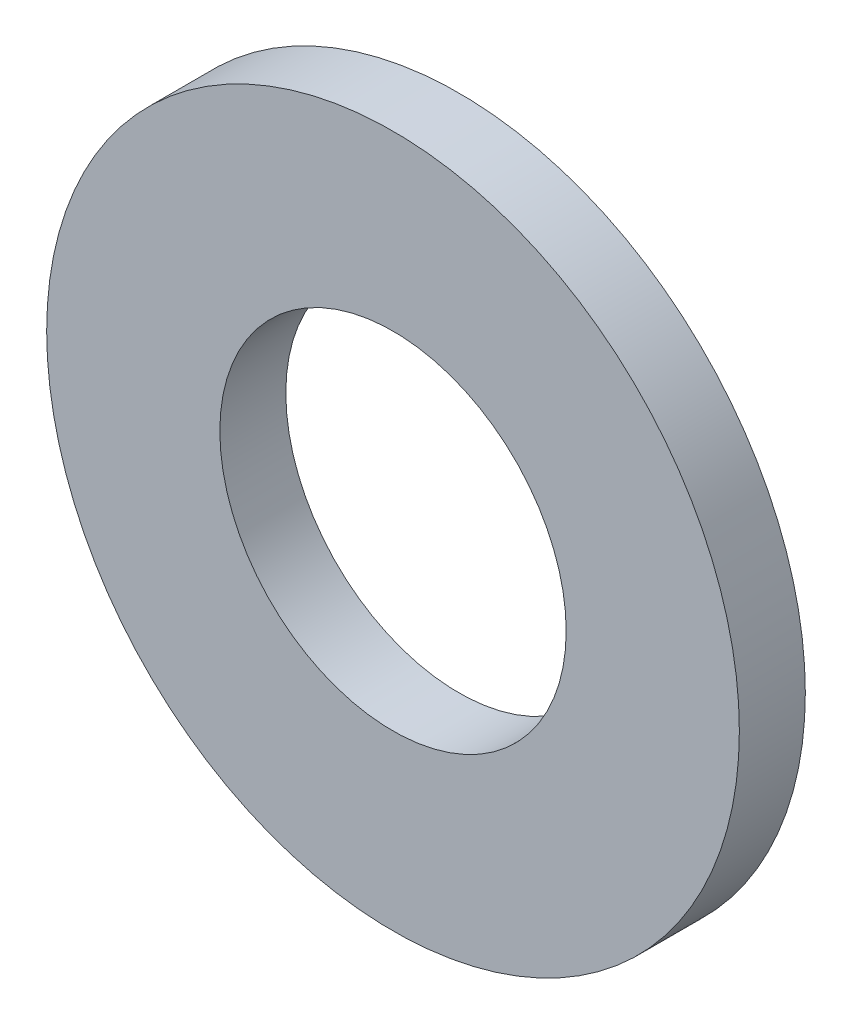
ISO-10303-21;
HEADER;
FILE_DESCRIPTION(('STEP AP214'),'2;1');
FILE_NAME('part.step','',(''),(''),'','','');
FILE_SCHEMA(('AUTOMOTIVE_DESIGN { 1 0 10303 214 1 1 1 1 }'));
ENDSEC;
DATA;
#1=APPLICATION_CONTEXT('core data for automotive mechanical design processes');
#2=APPLICATION_PROTOCOL_DEFINITION('international standard','automotive_design',2000,#1);
#3=PRODUCT_CONTEXT('',#1,'mechanical');
#4=PRODUCT('Part','Part','',(#3));
#5=PRODUCT_RELATED_PRODUCT_CATEGORY('part','',(#4));
#6=PRODUCT_DEFINITION_FORMATION('','',#4);
#7=PRODUCT_DEFINITION_CONTEXT('part definition',#1,'design');
#8=PRODUCT_DEFINITION('design','',#6,#7);
#9=PRODUCT_DEFINITION_SHAPE('','',#8);
#10=(LENGTH_UNIT() NAMED_UNIT(*) SI_UNIT(.MILLI.,.METRE.));
#11=(NAMED_UNIT(*) PLANE_ANGLE_UNIT() SI_UNIT($,.RADIAN.));
#12=(NAMED_UNIT(*) SI_UNIT($,.STERADIAN.) SOLID_ANGLE_UNIT());
#13=UNCERTAINTY_MEASURE_WITH_UNIT(LENGTH_MEASURE(1.E-05),#10,'distance_accuracy_value','');
#14=(GEOMETRIC_REPRESENTATION_CONTEXT(3) GLOBAL_UNCERTAINTY_ASSIGNED_CONTEXT((#13)) GLOBAL_UNIT_ASSIGNED_CONTEXT((#10,
#11,#12)) REPRESENTATION_CONTEXT('',''));
#15=CARTESIAN_POINT('',(0.,0.,0.));
#16=DIRECTION('',(0.,0.,1.));
#17=DIRECTION('',(1.,0.,0.));
#18=AXIS2_PLACEMENT_3D('',#15,#16,#17);
#19=CARTESIAN_POINT('',(0.,0.,2.));
#20=DIRECTION('',(0.,0.,1.));
#21=DIRECTION('',(1.,0.,0.));
#22=AXIS2_PLACEMENT_3D('',#19,#20,#21);
#23=PLANE('',#22);
#24=CARTESIAN_POINT('',(0.,0.,2.));
#25=DIRECTION('',(0.,0.,1.));
#26=DIRECTION('',(1.,0.,0.));
#27=AXIS2_PLACEMENT_3D('',#24,#25,#26);
#28=CIRCLE('',#27,10.5);
#29=CARTESIAN_POINT('',(10.5,0.,2.));
#30=VERTEX_POINT('',#29);
#31=EDGE_CURVE('E10',#30,#30,#28,.T.);
#32=ORIENTED_EDGE('',*,*,#31,.T.);
#33=EDGE_LOOP('',(#32));
#34=FACE_BOUND('',#33,.T.);
#35=CARTESIAN_POINT('',(0.,0.,2.));
#36=DIRECTION('',(0.,0.,1.));
#37=DIRECTION('',(1.,0.,0.));
#38=AXIS2_PLACEMENT_3D('',#35,#36,#37);
#39=CIRCLE('',#38,5.25);
#40=CARTESIAN_POINT('',(5.25,0.,2.));
#41=VERTEX_POINT('',#40);
#42=EDGE_CURVE('E38',#41,#41,#39,.T.);
#43=ORIENTED_EDGE('',*,*,#42,.F.);
#44=EDGE_LOOP('',(#43));
#45=FACE_BOUND('',#44,.T.);
#46=ADVANCED_FACE('F27',(#34,#45),#23,.T.);
#47=CARTESIAN_POINT('',(0.,0.,0.));
#48=DIRECTION('',(0.,0.,1.));
#49=DIRECTION('',(1.,0.,0.));
#50=AXIS2_PLACEMENT_3D('',#47,#48,#49);
#51=PLANE('',#50);
#52=CARTESIAN_POINT('',(0.,0.,0.));
#53=DIRECTION('',(0.,0.,1.));
#54=DIRECTION('',(1.,0.,0.));
#55=AXIS2_PLACEMENT_3D('',#52,#53,#54);
#56=CIRCLE('',#55,10.5);
#57=CARTESIAN_POINT('',(10.5,0.,0.));
#58=VERTEX_POINT('',#57);
#59=EDGE_CURVE('E34',#58,#58,#56,.T.);
#60=ORIENTED_EDGE('',*,*,#59,.F.);
#61=EDGE_LOOP('',(#60));
#62=FACE_BOUND('',#61,.T.);
#63=CARTESIAN_POINT('',(0.,0.,0.));
#64=DIRECTION('',(0.,0.,1.));
#65=DIRECTION('',(1.,0.,0.));
#66=AXIS2_PLACEMENT_3D('',#63,#64,#65);
#67=CIRCLE('',#66,5.25);
#68=CARTESIAN_POINT('',(5.25,0.,0.));
#69=VERTEX_POINT('',#68);
#70=EDGE_CURVE('E42',#69,#69,#67,.T.);
#71=ORIENTED_EDGE('',*,*,#70,.T.);
#72=EDGE_LOOP('',(#71));
#73=FACE_BOUND('',#72,.T.);
#74=ADVANCED_FACE('F48',(#62,#73),#51,.F.);
#75=CARTESIAN_POINT('',(0.,0.,2.));
#76=DIRECTION('',(0.,0.,-1.));
#77=DIRECTION('',(-1.,0.,0.));
#78=AXIS2_PLACEMENT_3D('',#75,#76,#77);
#79=CYLINDRICAL_SURFACE('',#78,10.5);
#80=ORIENTED_EDGE('',*,*,#31,.F.);
#81=EDGE_LOOP('',(#80));
#82=FACE_BOUND('',#81,.T.);
#83=ORIENTED_EDGE('',*,*,#59,.T.);
#84=EDGE_LOOP('',(#83));
#85=FACE_BOUND('',#84,.T.);
#86=ADVANCED_FACE('F29',(#82,#85),#79,.T.);
#87=CARTESIAN_POINT('',(0.,0.,2.));
#88=DIRECTION('',(0.,0.,-1.));
#89=DIRECTION('',(-1.,0.,0.));
#90=AXIS2_PLACEMENT_3D('',#87,#88,#89);
#91=CYLINDRICAL_SURFACE('',#90,5.25);
#92=ORIENTED_EDGE('',*,*,#42,.T.);
#93=EDGE_LOOP('',(#92));
#94=FACE_BOUND('',#93,.T.);
#95=ORIENTED_EDGE('',*,*,#70,.F.);
#96=EDGE_LOOP('',(#95));
#97=FACE_BOUND('',#96,.T.);
#98=ADVANCED_FACE('F50',(#94,#97),#91,.F.);
#99=CLOSED_SHELL('',(#46,#74,#86,#98));
#100=MANIFOLD_SOLID_BREP('B2',#99);
#101=ADVANCED_BREP_SHAPE_REPRESENTATION('',(#18,#100),#14);
#102=SHAPE_DEFINITION_REPRESENTATION(#9,#101);
ENDSEC;
END-ISO-10303-21;
